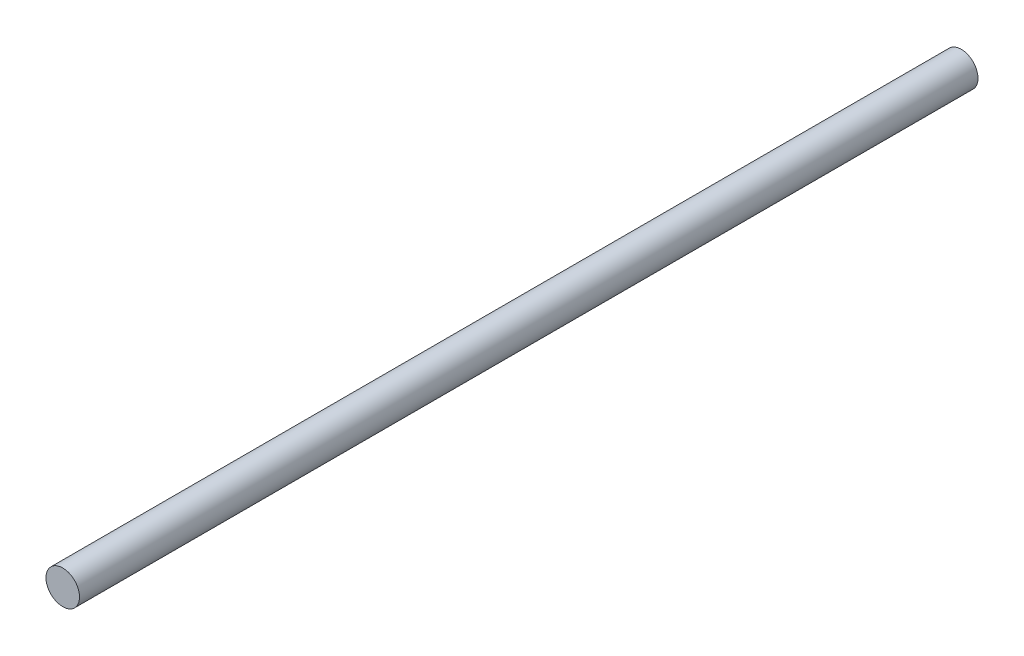
ISO-10303-21;
HEADER;
FILE_DESCRIPTION(('STEP AP214'),'2;1');
FILE_NAME('part.step','',(''),(''),'','','');
FILE_SCHEMA(('AUTOMOTIVE_DESIGN { 1 0 10303 214 1 1 1 1 }'));
ENDSEC;
DATA;
#1=APPLICATION_CONTEXT('core data for automotive mechanical design processes');
#2=APPLICATION_PROTOCOL_DEFINITION('international standard','automotive_design',2000,#1);
#3=PRODUCT_CONTEXT('',#1,'mechanical');
#4=PRODUCT('Part','Part','',(#3));
#5=PRODUCT_RELATED_PRODUCT_CATEGORY('part','',(#4));
#6=PRODUCT_DEFINITION_FORMATION('','',#4);
#7=PRODUCT_DEFINITION_CONTEXT('part definition',#1,'design');
#8=PRODUCT_DEFINITION('design','',#6,#7);
#9=PRODUCT_DEFINITION_SHAPE('','',#8);
#10=(LENGTH_UNIT() NAMED_UNIT(*) SI_UNIT(.MILLI.,.METRE.));
#11=(NAMED_UNIT(*) PLANE_ANGLE_UNIT() SI_UNIT($,.RADIAN.));
#12=(NAMED_UNIT(*) SI_UNIT($,.STERADIAN.) SOLID_ANGLE_UNIT());
#13=UNCERTAINTY_MEASURE_WITH_UNIT(LENGTH_MEASURE(1.E-05),#10,'distance_accuracy_value','');
#14=(GEOMETRIC_REPRESENTATION_CONTEXT(3) GLOBAL_UNCERTAINTY_ASSIGNED_CONTEXT((#13)) GLOBAL_UNIT_ASSIGNED_CONTEXT((#10,
#11,#12)) REPRESENTATION_CONTEXT('',''));
#15=CARTESIAN_POINT('',(0.,0.,0.));
#16=DIRECTION('',(0.,0.,1.));
#17=DIRECTION('',(1.,0.,0.));
#18=AXIS2_PLACEMENT_3D('',#15,#16,#17);
#19=CARTESIAN_POINT('',(0.,0.,42.5));
#20=DIRECTION('',(0.,0.,-1.));
#21=DIRECTION('',(-1.,0.,0.));
#22=AXIS2_PLACEMENT_3D('',#19,#20,#21);
#23=CYLINDRICAL_SURFACE('',#22,0.79375);
#24=CARTESIAN_POINT('',(0.,0.,42.5));
#25=DIRECTION('',(0.,0.,1.));
#26=DIRECTION('',(1.,0.,0.));
#27=AXIS2_PLACEMENT_3D('',#24,#25,#26);
#28=CIRCLE('',#27,0.79375);
#29=CARTESIAN_POINT('',(0.79375,0.,42.5));
#30=VERTEX_POINT('',#29);
#31=EDGE_CURVE('E10',#30,#30,#28,.T.);
#32=ORIENTED_EDGE('',*,*,#31,.F.);
#33=EDGE_LOOP('',(#32));
#34=FACE_BOUND('',#33,.T.);
#35=CARTESIAN_POINT('',(0.,0.,0.));
#36=DIRECTION('',(0.,0.,1.));
#37=DIRECTION('',(1.,0.,0.));
#38=AXIS2_PLACEMENT_3D('',#35,#36,#37);
#39=CIRCLE('',#38,0.79375);
#40=CARTESIAN_POINT('',(0.79375,0.,0.));
#41=VERTEX_POINT('',#40);
#42=EDGE_CURVE('E34',#41,#41,#39,.T.);
#43=ORIENTED_EDGE('',*,*,#42,.T.);
#44=EDGE_LOOP('',(#43));
#45=FACE_BOUND('',#44,.T.);
#46=ADVANCED_FACE('F31',(#34,#45),#23,.T.);
#47=CARTESIAN_POINT('',(0.,0.,42.5));
#48=DIRECTION('',(0.,0.,1.));
#49=DIRECTION('',(1.,0.,0.));
#50=AXIS2_PLACEMENT_3D('',#47,#48,#49);
#51=PLANE('',#50);
#52=ORIENTED_EDGE('',*,*,#31,.T.);
#53=EDGE_LOOP('',(#52));
#54=FACE_BOUND('',#53,.T.);
#55=ADVANCED_FACE('F46',(#54),#51,.T.);
#56=CARTESIAN_POINT('',(0.,0.,0.));
#57=DIRECTION('',(0.,0.,1.));
#58=DIRECTION('',(1.,0.,0.));
#59=AXIS2_PLACEMENT_3D('',#56,#57,#58);
#60=PLANE('',#59);
#61=ORIENTED_EDGE('',*,*,#42,.F.);
#62=EDGE_LOOP('',(#61));
#63=FACE_BOUND('',#62,.T.);
#64=ADVANCED_FACE('F44',(#63),#60,.F.);
#65=CLOSED_SHELL('',(#46,#55,#64));
#66=MANIFOLD_SOLID_BREP('B2',#65);
#67=ADVANCED_BREP_SHAPE_REPRESENTATION('',(#18,#66),#14);
#68=SHAPE_DEFINITION_REPRESENTATION(#9,#67);
ENDSEC;
END-ISO-10303-21;
